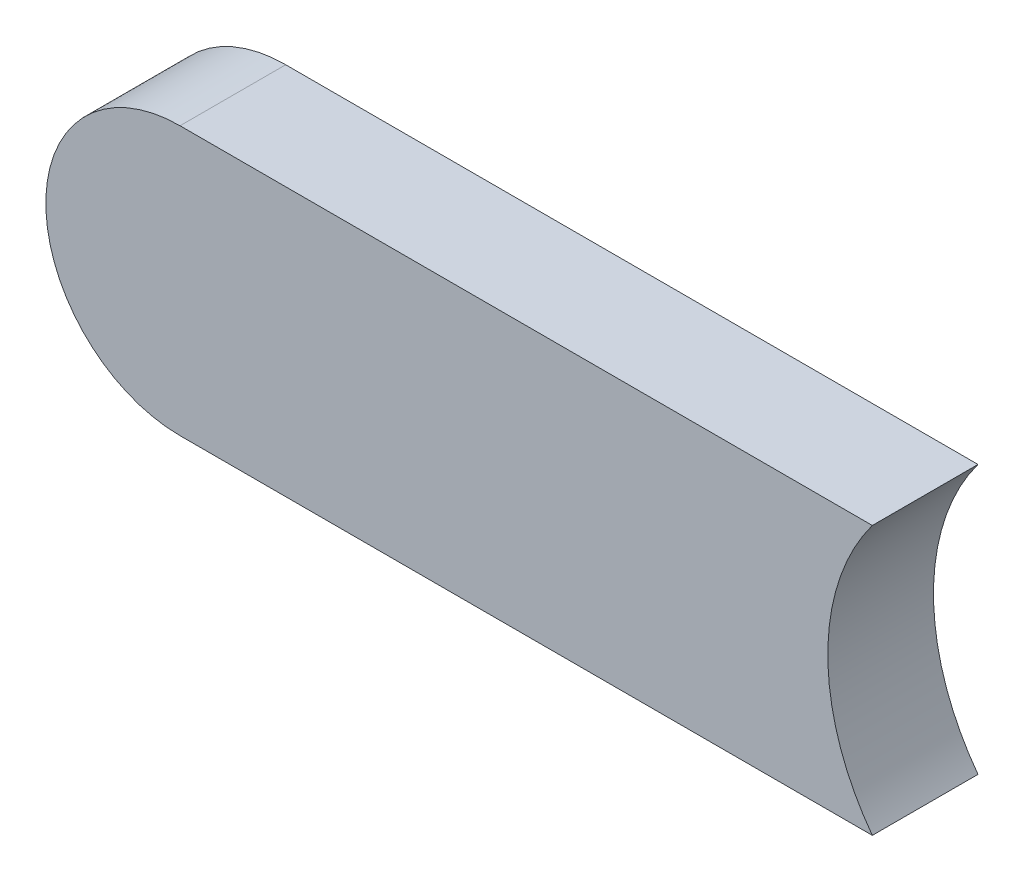
ISO-10303-21;
HEADER;
FILE_DESCRIPTION(('STEP AP214'),'2;1');
FILE_NAME('part.step','',(''),(''),'','','');
FILE_SCHEMA(('AUTOMOTIVE_DESIGN { 1 0 10303 214 1 1 1 1 }'));
ENDSEC;
DATA;
#1=APPLICATION_CONTEXT('core data for automotive mechanical design processes');
#2=APPLICATION_PROTOCOL_DEFINITION('international standard','automotive_design',2000,#1);
#3=PRODUCT_CONTEXT('',#1,'mechanical');
#4=PRODUCT('Part','Part','',(#3));
#5=PRODUCT_RELATED_PRODUCT_CATEGORY('part','',(#4));
#6=PRODUCT_DEFINITION_FORMATION('','',#4);
#7=PRODUCT_DEFINITION_CONTEXT('part definition',#1,'design');
#8=PRODUCT_DEFINITION('design','',#6,#7);
#9=PRODUCT_DEFINITION_SHAPE('','',#8);
#10=(LENGTH_UNIT() NAMED_UNIT(*) SI_UNIT(.MILLI.,.METRE.));
#11=(NAMED_UNIT(*) PLANE_ANGLE_UNIT() SI_UNIT($,.RADIAN.));
#12=(NAMED_UNIT(*) SI_UNIT($,.STERADIAN.) SOLID_ANGLE_UNIT());
#13=UNCERTAINTY_MEASURE_WITH_UNIT(LENGTH_MEASURE(1.E-05),#10,'distance_accuracy_value','');
#14=(GEOMETRIC_REPRESENTATION_CONTEXT(3) GLOBAL_UNCERTAINTY_ASSIGNED_CONTEXT((#13)) GLOBAL_UNIT_ASSIGNED_CONTEXT((#10,
#11,#12)) REPRESENTATION_CONTEXT('',''));
#15=CARTESIAN_POINT('',(0.,0.,0.));
#16=DIRECTION('',(0.,0.,1.));
#17=DIRECTION('',(1.,0.,0.));
#18=AXIS2_PLACEMENT_3D('',#15,#16,#17);
#19=CARTESIAN_POINT('',(92.456,114.935,0.));
#20=DIRECTION('',(0.,1.,0.));
#21=DIRECTION('',(1.,0.,0.));
#22=AXIS2_PLACEMENT_3D('',#19,#20,#21);
#23=PLANE('',#22);
#24=DIRECTION('',(1.,0.,0.));
#25=VECTOR('',#24,1.);
#26=CARTESIAN_POINT('',(92.456,114.935,0.1999996));
#27=LINE('',#26,#25);
#28=CARTESIAN_POINT('',(92.456,114.935,0.1999996));
#29=VERTEX_POINT('',#28);
#30=CARTESIAN_POINT('',(93.7662517688965,114.935,0.1999996));
#31=VERTEX_POINT('',#30);
#32=EDGE_CURVE('E11',#29,#31,#27,.T.);
#33=ORIENTED_EDGE('',*,*,#32,.F.);
#34=DIRECTION('',(0.,0.,1.));
#35=VECTOR('',#34,1.);
#36=CARTESIAN_POINT('',(92.456,114.935,0.));
#37=LINE('',#36,#35);
#38=CARTESIAN_POINT('',(92.456,114.935,0.));
#39=VERTEX_POINT('',#38);
#40=EDGE_CURVE('E24',#39,#29,#37,.T.);
#41=ORIENTED_EDGE('',*,*,#40,.F.);
#42=DIRECTION('',(1.,0.,0.));
#43=VECTOR('',#42,1.);
#44=CARTESIAN_POINT('',(92.456,114.935,0.));
#45=LINE('',#44,#43);
#46=CARTESIAN_POINT('',(93.7662517688965,114.935,0.));
#47=VERTEX_POINT('',#46);
#48=EDGE_CURVE('E75',#39,#47,#45,.T.);
#49=ORIENTED_EDGE('',*,*,#48,.T.);
#50=DIRECTION('',(0.,0.,1.));
#51=VECTOR('',#50,1.);
#52=CARTESIAN_POINT('',(93.7662517688965,114.935,0.));
#53=LINE('',#52,#51);
#54=EDGE_CURVE('E37',#47,#31,#53,.T.);
#55=ORIENTED_EDGE('',*,*,#54,.T.);
#56=EDGE_LOOP('',(#33,#41,#49,#55));
#57=FACE_BOUND('',#56,.T.);
#58=ADVANCED_FACE('F17',(#57),#23,.F.);
#59=CARTESIAN_POINT('',(94.107,115.189,0.));
#60=DIRECTION('',(0.,0.,-1.));
#61=DIRECTION('',(1.,0.,0.));
#62=AXIS2_PLACEMENT_3D('',#59,#60,#61);
#63=CYLINDRICAL_SURFACE('',#62,0.42500042);
#64=DIRECTION('',(0.,0.,1.));
#65=VECTOR('',#64,1.);
#66=CARTESIAN_POINT('',(93.7662517688965,115.443,0.));
#67=LINE('',#66,#65);
#68=CARTESIAN_POINT('',(93.7662517688965,115.443,0.));
#69=VERTEX_POINT('',#68);
#70=CARTESIAN_POINT('',(93.7662517688965,115.443,0.1999996));
#71=VERTEX_POINT('',#70);
#72=EDGE_CURVE('E67',#69,#71,#67,.T.);
#73=ORIENTED_EDGE('',*,*,#72,.T.);
#74=CARTESIAN_POINT('',(94.107,115.189,0.1999996));
#75=DIRECTION('',(0.,0.,1.));
#76=DIRECTION('',(1.,0.,0.));
#77=AXIS2_PLACEMENT_3D('',#74,#75,#76);
#78=CIRCLE('',#77,0.42500042);
#79=EDGE_CURVE('E82',#71,#31,#78,.T.);
#80=ORIENTED_EDGE('',*,*,#79,.T.);
#81=ORIENTED_EDGE('',*,*,#54,.F.);
#82=CARTESIAN_POINT('',(94.107,115.189,0.));
#83=DIRECTION('',(0.,0.,1.));
#84=DIRECTION('',(1.,0.,0.));
#85=AXIS2_PLACEMENT_3D('',#82,#83,#84);
#86=CIRCLE('',#85,0.42500042);
#87=EDGE_CURVE('E80',#69,#47,#86,.T.);
#88=ORIENTED_EDGE('',*,*,#87,.F.);
#89=EDGE_LOOP('',(#73,#80,#81,#88));
#90=FACE_BOUND('',#89,.T.);
#91=ADVANCED_FACE('F88',(#90),#63,.F.);
#92=CARTESIAN_POINT('',(93.7662517688965,115.443,0.));
#93=DIRECTION('',(0.,-1.,0.));
#94=DIRECTION('',(-1.,0.,0.));
#95=AXIS2_PLACEMENT_3D('',#92,#93,#94);
#96=PLANE('',#95);
#97=DIRECTION('',(-1.,0.,0.));
#98=VECTOR('',#97,1.);
#99=CARTESIAN_POINT('',(94.107,115.443,0.1999996));
#100=LINE('',#99,#98);
#101=CARTESIAN_POINT('',(92.456,115.443,0.1999996));
#102=VERTEX_POINT('',#101);
#103=EDGE_CURVE('E71',#71,#102,#100,.T.);
#104=ORIENTED_EDGE('',*,*,#103,.F.);
#105=ORIENTED_EDGE('',*,*,#72,.F.);
#106=DIRECTION('',(-1.,0.,0.));
#107=VECTOR('',#106,1.);
#108=CARTESIAN_POINT('',(94.107,115.443,0.));
#109=LINE('',#108,#107);
#110=CARTESIAN_POINT('',(92.456,115.443,0.));
#111=VERTEX_POINT('',#110);
#112=EDGE_CURVE('E63',#69,#111,#109,.T.);
#113=ORIENTED_EDGE('',*,*,#112,.T.);
#114=DIRECTION('',(0.,0.,1.));
#115=VECTOR('',#114,1.);
#116=CARTESIAN_POINT('',(92.456,115.443,0.));
#117=LINE('',#116,#115);
#118=EDGE_CURVE('E53',#111,#102,#117,.T.);
#119=ORIENTED_EDGE('',*,*,#118,.T.);
#120=EDGE_LOOP('',(#104,#105,#113,#119));
#121=FACE_BOUND('',#120,.T.);
#122=ADVANCED_FACE('F66',(#121),#96,.F.);
#123=CARTESIAN_POINT('',(92.456,115.189,0.));
#124=DIRECTION('',(0.,0.,-1.));
#125=DIRECTION('',(0.,1.,0.));
#126=AXIS2_PLACEMENT_3D('',#123,#124,#125);
#127=CYLINDRICAL_SURFACE('',#126,0.254);
#128=CARTESIAN_POINT('',(92.456,115.189,0.1999996));
#129=DIRECTION('',(0.,0.,1.));
#130=DIRECTION('',(0.,1.,0.));
#131=AXIS2_PLACEMENT_3D('',#128,#129,#130);
#132=CIRCLE('',#131,0.254);
#133=EDGE_CURVE('E59',#102,#29,#132,.T.);
#134=ORIENTED_EDGE('',*,*,#133,.F.);
#135=ORIENTED_EDGE('',*,*,#118,.F.);
#136=CARTESIAN_POINT('',(92.456,115.189,0.));
#137=DIRECTION('',(0.,0.,1.));
#138=DIRECTION('',(0.,1.,0.));
#139=AXIS2_PLACEMENT_3D('',#136,#137,#138);
#140=CIRCLE('',#139,0.254);
#141=EDGE_CURVE('E57',#111,#39,#140,.T.);
#142=ORIENTED_EDGE('',*,*,#141,.T.);
#143=ORIENTED_EDGE('',*,*,#40,.T.);
#144=EDGE_LOOP('',(#134,#135,#142,#143));
#145=FACE_BOUND('',#144,.T.);
#146=ADVANCED_FACE('F55',(#145),#127,.T.);
#147=CARTESIAN_POINT('',(92.456,114.935,0.));
#148=DIRECTION('',(0.,0.,-1.));
#149=DIRECTION('',(-1.,0.,0.));
#150=AXIS2_PLACEMENT_3D('',#147,#148,#149);
#151=PLANE('',#150);
#152=ORIENTED_EDGE('',*,*,#48,.F.);
#153=ORIENTED_EDGE('',*,*,#141,.F.);
#154=ORIENTED_EDGE('',*,*,#112,.F.);
#155=ORIENTED_EDGE('',*,*,#87,.T.);
#156=EDGE_LOOP('',(#152,#153,#154,#155));
#157=FACE_BOUND('',#156,.T.);
#158=ADVANCED_FACE('F74',(#157),#151,.T.);
#159=CARTESIAN_POINT('',(92.456,114.935,0.1999996));
#160=DIRECTION('',(0.,0.,-1.));
#161=DIRECTION('',(-1.,0.,0.));
#162=AXIS2_PLACEMENT_3D('',#159,#160,#161);
#163=PLANE('',#162);
#164=ORIENTED_EDGE('',*,*,#133,.T.);
#165=ORIENTED_EDGE('',*,*,#32,.T.);
#166=ORIENTED_EDGE('',*,*,#79,.F.);
#167=ORIENTED_EDGE('',*,*,#103,.T.);
#168=EDGE_LOOP('',(#164,#165,#166,#167));
#169=FACE_BOUND('',#168,.T.);
#170=ADVANCED_FACE('F91',(#169),#163,.F.);
#171=CLOSED_SHELL('',(#58,#91,#122,#146,#158,#170));
#172=MANIFOLD_SOLID_BREP('B1',#171);
#173=ADVANCED_BREP_SHAPE_REPRESENTATION('',(#18,#172),#14);
#174=SHAPE_DEFINITION_REPRESENTATION(#9,#173);
ENDSEC;
END-ISO-10303-21;
